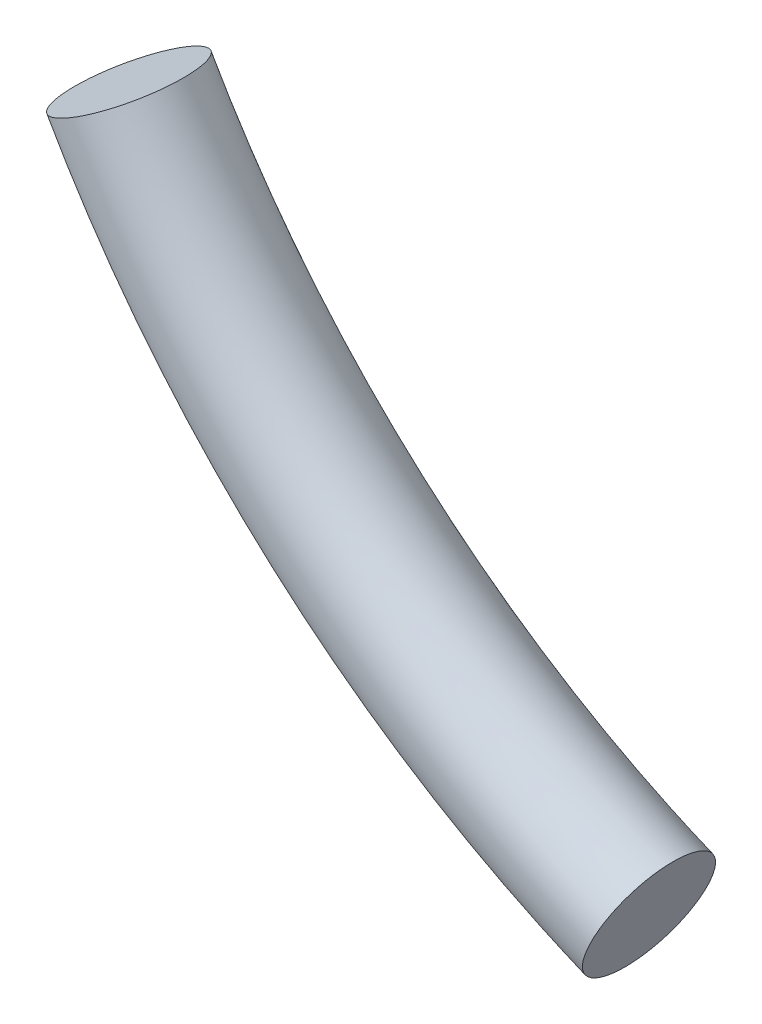
ISO-10303-21;
HEADER;
FILE_DESCRIPTION(('STEP AP214'),'2;1');
FILE_NAME('part.step','',(''),(''),'','','');
FILE_SCHEMA(('AUTOMOTIVE_DESIGN { 1 0 10303 214 1 1 1 1 }'));
ENDSEC;
DATA;
#1=APPLICATION_CONTEXT('core data for automotive mechanical design processes');
#2=APPLICATION_PROTOCOL_DEFINITION('international standard','automotive_design',2000,#1);
#3=PRODUCT_CONTEXT('',#1,'mechanical');
#4=PRODUCT('Part','Part','',(#3));
#5=PRODUCT_RELATED_PRODUCT_CATEGORY('part','',(#4));
#6=PRODUCT_DEFINITION_FORMATION('','',#4);
#7=PRODUCT_DEFINITION_CONTEXT('part definition',#1,'design');
#8=PRODUCT_DEFINITION('design','',#6,#7);
#9=PRODUCT_DEFINITION_SHAPE('','',#8);
#10=(LENGTH_UNIT() NAMED_UNIT(*) SI_UNIT(.MILLI.,.METRE.));
#11=(NAMED_UNIT(*) PLANE_ANGLE_UNIT() SI_UNIT($,.RADIAN.));
#12=(NAMED_UNIT(*) SI_UNIT($,.STERADIAN.) SOLID_ANGLE_UNIT());
#13=UNCERTAINTY_MEASURE_WITH_UNIT(LENGTH_MEASURE(1.E-05),#10,'distance_accuracy_value','');
#14=(GEOMETRIC_REPRESENTATION_CONTEXT(3) GLOBAL_UNCERTAINTY_ASSIGNED_CONTEXT((#13)) GLOBAL_UNIT_ASSIGNED_CONTEXT((#10,
#11,#12)) REPRESENTATION_CONTEXT('',''));
#15=CARTESIAN_POINT('',(0.,0.,0.));
#16=DIRECTION('',(0.,0.,1.));
#17=DIRECTION('',(1.,0.,0.));
#18=AXIS2_PLACEMENT_3D('',#15,#16,#17);
#19=CARTESIAN_POINT('',(0.,0.,-107.5));
#20=DIRECTION('',(-0.491846967669776,0.870681664211465,0.));
#21=DIRECTION('',(-0.870681664211465,-0.491846967669776,0.));
#22=AXIS2_PLACEMENT_3D('',#19,#20,#21);
#23=PLANE('',#22);
#24=CARTESIAN_POINT('',(-6.32304332916155,-3.57187915598206,-102.2302));
#25=CARTESIAN_POINT('',(-6.32304172216329,-3.57187824819078,-102.25265524156));
#26=CARTESIAN_POINT('',(-6.32139090801497,-3.57094570537242,-102.275130857259));
#27=CARTESIAN_POINT('',(-6.31482343351021,-3.5672357473554,-102.319482451298));
#28=CARTESIAN_POINT('',(-6.30989978350673,-3.56445438371399,-102.341357041711));
#29=CARTESIAN_POINT('',(-6.2969333229611,-3.55712964659948,-102.383809618347));
#30=CARTESIAN_POINT('',(-6.28889607957243,-3.55258941800431,-102.404389843003));
#31=CARTESIAN_POINT('',(-6.26991567433977,-3.54186741116466,-102.443737337222));
#32=CARTESIAN_POINT('',(-6.25896839012532,-3.53568330419834,-102.46250198299));
#33=CARTESIAN_POINT('',(-6.2345019676866,-3.52186225319791,-102.497627484938));
#34=CARTESIAN_POINT('',(-6.22098647770209,-3.5142273700498,-102.513991693303));
#35=CARTESIAN_POINT('',(-6.19173608714498,-3.49770386152766,-102.543904884907));
#36=CARTESIAN_POINT('',(-6.17599810610279,-3.48881349600026,-102.557449895039));
#37=CARTESIAN_POINT('',(-6.14277670580989,-3.47004676911552,-102.581301941874));
#38=CARTESIAN_POINT('',(-6.12529456621462,-3.46017113063392,-102.5916113298));
#39=CARTESIAN_POINT('',(-6.08907038413636,-3.4397081361276,-102.608713483024));
#40=CARTESIAN_POINT('',(-6.0703282676056,-3.42912073827339,-102.615506041437));
#41=CARTESIAN_POINT('',(-6.03211770610177,-3.40753564054926,-102.625380612929));
#42=CARTESIAN_POINT('',(-6.01264928250519,-3.39653795275488,-102.628462735124));
#43=CARTESIAN_POINT('',(-5.97353823169905,-3.37444416976612,-102.630829316177));
#44=CARTESIAN_POINT('',(-5.95389560448949,-3.36334807457174,-102.630113775036));
#45=CARTESIAN_POINT('',(-5.91499316252704,-3.34137213445417,-102.624905254934));
#46=CARTESIAN_POINT('',(-5.89573335904942,-3.33049229590036,-102.620412164882));
#47=CARTESIAN_POINT('',(-5.85814505886288,-3.30925871280504,-102.607776350926));
#48=CARTESIAN_POINT('',(-5.83981650744378,-3.29890493735781,-102.599633841699));
#49=CARTESIAN_POINT('',(-5.80459682769468,-3.27900938494304,-102.579923114515));
#50=CARTESIAN_POINT('',(-5.78770675682602,-3.26946820533407,-102.568352403919));
#51=CARTESIAN_POINT('',(-5.75588157810259,-3.25149020224285,-102.542134850302));
#52=CARTESIAN_POINT('',(-5.74094377032538,-3.24305185357783,-102.527492330157));
#53=CARTESIAN_POINT('',(-5.71339920920925,-3.22749196594308,-102.495513974748));
#54=CARTESIAN_POINT('',(-5.70079577722735,-3.22037230320372,-102.478174365578));
#55=CARTESIAN_POINT('',(-5.67832059912858,-3.20767610360507,-102.441335318358));
#56=CARTESIAN_POINT('',(-5.66844499350969,-3.20209738651798,-102.421838987082));
#57=CARTESIAN_POINT('',(-5.65166638785582,-3.19261917346745,-102.381186262625));
#58=CARTESIAN_POINT('',(-5.64476871936395,-3.18872268928596,-102.36002697154));
#59=CARTESIAN_POINT('',(-5.63417993713913,-3.18274109963882,-102.316713490036));
#60=CARTESIAN_POINT('',(-5.63048199943244,-3.18065213931908,-102.294561523395));
#61=CARTESIAN_POINT('',(-5.62714060817691,-3.17876459163732,-102.258269762147));
#62=CARTESIAN_POINT('',(-5.6264969931081,-3.17840101430136,-102.244238862857));
#63=CARTESIAN_POINT('',(-5.62649960479063,-3.17840248963751,-102.20774475844));
#64=CARTESIAN_POINT('',(-5.62815041893895,-3.17933503245587,-102.185269142741));
#65=CARTESIAN_POINT('',(-5.63471789344371,-3.18304499047289,-102.140917548703));
#66=CARTESIAN_POINT('',(-5.63964154344719,-3.1858263541143,-102.119042958289));
#67=CARTESIAN_POINT('',(-5.65260800399282,-3.19315109122882,-102.076590381653));
#68=CARTESIAN_POINT('',(-5.66064524738149,-3.19769131982398,-102.056010156997));
#69=CARTESIAN_POINT('',(-5.67962565261415,-3.20841332666363,-102.016662662778));
#70=CARTESIAN_POINT('',(-5.6905729368286,-3.21459743362995,-101.99789801701));
#71=CARTESIAN_POINT('',(-5.71503935926732,-3.22841848463039,-101.962772515062));
#72=CARTESIAN_POINT('',(-5.72855484925183,-3.23605336777849,-101.946408306697));
#73=CARTESIAN_POINT('',(-5.75780523980894,-3.25257687630063,-101.916495115093));
#74=CARTESIAN_POINT('',(-5.77354322085113,-3.26146724182803,-101.902950104961));
#75=CARTESIAN_POINT('',(-5.80676462114403,-3.28023396871277,-101.879098058126));
#76=CARTESIAN_POINT('',(-5.8242467607393,-3.29010960719437,-101.8687886702));
#77=CARTESIAN_POINT('',(-5.86047094281756,-3.31057260170069,-101.851686516976));
#78=CARTESIAN_POINT('',(-5.87921305934832,-3.3211599995549,-101.844893958563));
#79=CARTESIAN_POINT('',(-5.91742362085215,-3.34274509727903,-101.835019387071));
#80=CARTESIAN_POINT('',(-5.93689204444873,-3.35374278507342,-101.831937264876));
#81=CARTESIAN_POINT('',(-5.97600309525487,-3.37583656806217,-101.829570683823));
#82=CARTESIAN_POINT('',(-5.99564572246443,-3.38693266325655,-101.830286224964));
#83=CARTESIAN_POINT('',(-6.03454816442688,-3.40890860337412,-101.835494745066));
#84=CARTESIAN_POINT('',(-6.0538079679045,-3.41978844192793,-101.839987835118));
#85=CARTESIAN_POINT('',(-6.09139626809104,-3.44102202502326,-101.852623649074));
#86=CARTESIAN_POINT('',(-6.10972481951014,-3.45137580047048,-101.860766158301));
#87=CARTESIAN_POINT('',(-6.14494449925924,-3.47127135288525,-101.880476885485));
#88=CARTESIAN_POINT('',(-6.1618345701279,-3.48081253249422,-101.892047596081));
#89=CARTESIAN_POINT('',(-6.19365974885133,-3.49879053558545,-101.918265149698));
#90=CARTESIAN_POINT('',(-6.20859755662853,-3.50722888425046,-101.932907669844));
#91=CARTESIAN_POINT('',(-6.23614211774466,-3.52278877188521,-101.964886025252));
#92=CARTESIAN_POINT('',(-6.24874554972657,-3.52990843462457,-101.982225634422));
#93=CARTESIAN_POINT('',(-6.27122072782534,-3.54260463422323,-102.019064681642));
#94=CARTESIAN_POINT('',(-6.28109633344423,-3.54818335131032,-102.038561012918));
#95=CARTESIAN_POINT('',(-6.2978749390981,-3.55766156436084,-102.079213737375));
#96=CARTESIAN_POINT('',(-6.30477260758997,-3.56155804854234,-102.10037302846));
#97=CARTESIAN_POINT('',(-6.31536138981479,-3.56753963818947,-102.143686509964));
#98=CARTESIAN_POINT('',(-6.31905932752148,-3.56962859850921,-102.165838476605));
#99=CARTESIAN_POINT('',(-6.32240071877701,-3.57151614619097,-102.202130237853));
#100=CARTESIAN_POINT('',(-6.32304433384582,-3.57187972352693,-102.216161137143));
#101=CARTESIAN_POINT('',(-6.32304332916155,-3.57187915598206,-102.2302));
#102=B_SPLINE_CURVE_WITH_KNOTS('',3,(#24,#25,#26,#27,#28,#29,#30,#31,#32,#33,#34,#35,#36,#37,
#38,#39,#40,#41,#42,#43,#44,#45,#46,#47,#48,#49,#50,#51,#52,#53,#54,#55,#56,#57,#58,#59,#60,#61,
#62,#63,#64,#65,#66,#67,#68,#69,#70,#71,#72,#73,#74,#75,#76,#77,#78,#79,#80,#81,#82,#83,#84,#85,
#86,#87,#88,#89,#90,#91,#92,#93,#94,#95,#96,#97,#98,#99,#100,#101),.UNSPECIFIED.,.T.,.F.,(4,2,2,
2,2,2,2,2,2,2,2,2,2,2,2,2,2,2,2,2,2,2,2,2,2,2,2,2,2,2,2,2,2,2,2,2,2,2,4),(0.,0.0673217190940813,
0.134787678055445,0.202133559490878,0.269575356418609,0.336922056232666,0.404363034793442,
0.471754892083641,0.539150713403539,0.606544552708795,0.673938392014053,0.741334213333949,
0.808726070624145,0.876167049184931,0.943513748998996,1.01095554592845,1.07830142736559,
1.1457673863287,1.21308910542448,1.25517818200736,1.32249990110144,1.3899658600628,
1.45731174149823,1.52475353842596,1.59210023824002,1.6595412168008,1.72693307409099,
1.7943288954109,1.86172273471615,1.92911657402141,1.9965123953413,2.0639042526315,
2.13134523119229,2.19869193100635,2.2661337279358,2.33347960937294,2.40094556833606,
2.46826728743184,2.51035636401471),.UNSPECIFIED.);
#103=CARTESIAN_POINT('',(-6.32304332916155,-3.57187915598206,-102.2302));
#104=VERTEX_POINT('',#103);
#105=EDGE_CURVE('E19',#104,#104,#102,.T.);
#106=ORIENTED_EDGE('',*,*,#105,.F.);
#107=EDGE_LOOP('',(#106));
#108=FACE_BOUND('',#107,.T.);
#109=ADVANCED_FACE('F15',(#108),#23,.T.);
#110=CARTESIAN_POINT('',(0.,0.,-107.5));
#111=DIRECTION('',(-0.923625857580072,0.383295284616804,0.));
#112=DIRECTION('',(-0.383295284616804,-0.923625857580072,0.));
#113=AXIS2_PLACEMENT_3D('',#110,#111,#112);
#114=PLANE('',#113);
#115=CARTESIAN_POINT('',(-2.47692152035022,-5.96863268401315,-102.2302));
#116=CARTESIAN_POINT('',(-2.47692222779001,-5.96863438872935,-102.25265524156));
#117=CARTESIAN_POINT('',(-2.47764895640374,-5.97038558517246,-102.275130857259));
#118=CARTESIAN_POINT('',(-2.48054011871137,-5.97735241302807,-102.319482451298));
#119=CARTESIAN_POINT('',(-2.48270762941822,-5.98257545911232,-102.341357041711));
#120=CARTESIAN_POINT('',(-2.4884157813061,-5.99633038095517,-102.383809618347));
#121=CARTESIAN_POINT('',(-2.49195397169051,-6.00485635103422,-102.404389843003));
#122=CARTESIAN_POINT('',(-2.50030960857231,-6.02499091201193,-102.443737337222));
#123=CARTESIAN_POINT('',(-2.50512886983763,-6.03660387595312,-102.46250198299));
#124=CARTESIAN_POINT('',(-2.51589958517215,-6.06255804650217,-102.497627484938));
#125=CARTESIAN_POINT('',(-2.5218494331973,-6.07689538302902,-102.513991693303));
#126=CARTESIAN_POINT('',(-2.5347261678692,-6.10792442403602,-102.543904884907));
#127=CARTESIAN_POINT('',(-2.54165441061372,-6.12461939630219,-102.557449895039));
#128=CARTESIAN_POINT('',(-2.55627928053351,-6.15986091521408,-102.581301941874));
#129=CARTESIAN_POINT('',(-2.56397534437327,-6.17840610439138,-102.5916113298));
#130=CARTESIAN_POINT('',(-2.57992211200421,-6.21683299749413,-102.608713483024));
#131=CARTESIAN_POINT('',(-2.58817284839302,-6.23671477997001,-102.615506041437));
#132=CARTESIAN_POINT('',(-2.6049940686495,-6.27724883976275,-102.625380612929));
#133=CARTESIAN_POINT('',(-2.61356454310672,-6.29790109440327,-102.628462735124));
#134=CARTESIAN_POINT('',(-2.63078218069643,-6.3393904002271,-102.630829316177));
#135=CARTESIAN_POINT('',(-2.63942934382892,-6.36022745141042,-102.630113775036));
#136=CARTESIAN_POINT('',(-2.65655514672244,-6.40149546335607,-102.624905254934));
#137=CARTESIAN_POINT('',(-2.66503378151981,-6.42192641215748,-102.620412164882));
#138=CARTESIAN_POINT('',(-2.68158106718169,-6.46180037232203,-102.607776350926));
#139=CARTESIAN_POINT('',(-2.68964974213094,-6.48124344172214,-102.599633841699));
#140=CARTESIAN_POINT('',(-2.70515430335972,-6.51860475096875,-102.579923114515));
#141=CARTESIAN_POINT('',(-2.712589724119,-6.53652186905207,-102.568352403919));
#142=CARTESIAN_POINT('',(-2.72659994328196,-6.5702822653017,-102.542134850302));
#143=CARTESIAN_POINT('',(-2.7331759302573,-6.58612840756665,-102.527492330157));
#144=CARTESIAN_POINT('',(-2.74530171724308,-6.6153478914817,-102.495513974748));
#145=CARTESIAN_POINT('',(-2.75085005511123,-6.62871770981052,-102.478174365578));
#146=CARTESIAN_POINT('',(-2.76074417616635,-6.65255955293069,-102.441335318358));
#147=CARTESIAN_POINT('',(-2.76509165840015,-6.66303567191171,-102.421838987082));
#148=CARTESIAN_POINT('',(-2.77247800945579,-6.68083454683127,-102.381186262625));
#149=CARTESIAN_POINT('',(-2.77551453120244,-6.68815164702756,-102.36002697154));
#150=CARTESIAN_POINT('',(-2.78017597115625,-6.6993843092796,-102.316713490036));
#151=CARTESIAN_POINT('',(-2.78180389344294,-6.70330711025957,-102.294561523395));
#152=CARTESIAN_POINT('',(-2.78327485529381,-6.70685168400076,-102.258269762147));
#153=CARTESIAN_POINT('',(-2.78355819033016,-6.70753443585407,-102.244238862857));
#154=CARTESIAN_POINT('',(-2.78355704060387,-6.70753166536101,-102.20774475844));
#155=CARTESIAN_POINT('',(-2.78283031199015,-6.7057804689179,-102.185269142741));
#156=CARTESIAN_POINT('',(-2.77993914968251,-6.69881364106229,-102.140917548703));
#157=CARTESIAN_POINT('',(-2.77777163897566,-6.69359059497803,-102.119042958289));
#158=CARTESIAN_POINT('',(-2.77206348708778,-6.67983567313518,-102.076590381653));
#159=CARTESIAN_POINT('',(-2.76852529670337,-6.67130970305614,-102.056010156997));
#160=CARTESIAN_POINT('',(-2.76016965982157,-6.65117514207843,-102.016662662778));
#161=CARTESIAN_POINT('',(-2.75535039855625,-6.63956217813724,-101.99789801701));
#162=CARTESIAN_POINT('',(-2.74457968322173,-6.61360800758818,-101.962772515062));
#163=CARTESIAN_POINT('',(-2.73862983519658,-6.59927067106134,-101.946408306697));
#164=CARTESIAN_POINT('',(-2.72575310052468,-6.56824163005434,-101.916495115093));
#165=CARTESIAN_POINT('',(-2.71882485778016,-6.55154665778817,-101.902950104961));
#166=CARTESIAN_POINT('',(-2.70419998786037,-6.51630513887628,-101.879098058126));
#167=CARTESIAN_POINT('',(-2.69650392402061,-6.49775994969897,-101.8687886702));
#168=CARTESIAN_POINT('',(-2.68055715638967,-6.45933305659623,-101.851686516976));
#169=CARTESIAN_POINT('',(-2.67230642000086,-6.43945127412035,-101.844893958563));
#170=CARTESIAN_POINT('',(-2.65548519974438,-6.39891721432761,-101.835019387071));
#171=CARTESIAN_POINT('',(-2.64691472528717,-6.37826495968709,-101.831937264876));
#172=CARTESIAN_POINT('',(-2.62969708769745,-6.33677565386326,-101.829570683823));
#173=CARTESIAN_POINT('',(-2.62104992456496,-6.31593860267994,-101.830286224964));
#174=CARTESIAN_POINT('',(-2.60392412167144,-6.27467059073429,-101.835494745066));
#175=CARTESIAN_POINT('',(-2.59544548687407,-6.25423964193287,-101.839987835118));
#176=CARTESIAN_POINT('',(-2.57889820121219,-6.21436568176833,-101.852623649074));
#177=CARTESIAN_POINT('',(-2.57082952626294,-6.19492261236822,-101.860766158301));
#178=CARTESIAN_POINT('',(-2.55532496503416,-6.1575613031216,-101.880476885485));
#179=CARTESIAN_POINT('',(-2.54788954427488,-6.13964418503829,-101.892047596081));
#180=CARTESIAN_POINT('',(-2.53387932511192,-6.10588378878866,-101.918265149698));
#181=CARTESIAN_POINT('',(-2.52730333813659,-6.0900376465237,-101.932907669844));
#182=CARTESIAN_POINT('',(-2.5151775511508,-6.06081816260866,-101.964886025252));
#183=CARTESIAN_POINT('',(-2.50962921328265,-6.04744834427984,-101.982225634422));
#184=CARTESIAN_POINT('',(-2.49973509222753,-6.02360650115966,-102.019064681642));
#185=CARTESIAN_POINT('',(-2.49538760999373,-6.01313038217865,-102.038561012918));
#186=CARTESIAN_POINT('',(-2.48800125893809,-5.99533150725909,-102.079213737375));
#187=CARTESIAN_POINT('',(-2.48496473719145,-5.9880144070628,-102.10037302846));
#188=CARTESIAN_POINT('',(-2.48030329723763,-5.97678174481076,-102.143686509964));
#189=CARTESIAN_POINT('',(-2.47867537495094,-5.97285894383078,-102.165838476605));
#190=CARTESIAN_POINT('',(-2.47720441310008,-5.96931437008959,-102.202130237853));
#191=CARTESIAN_POINT('',(-2.47692107806372,-5.96863161823628,-102.216161137143));
#192=CARTESIAN_POINT('',(-2.47692152035022,-5.96863268401315,-102.2302));
#193=B_SPLINE_CURVE_WITH_KNOTS('',3,(#115,#116,#117,#118,#119,#120,#121,#122,#123,#124,#125,
#126,#127,#128,#129,#130,#131,#132,#133,#134,#135,#136,#137,#138,#139,#140,#141,#142,#143,#144,
#145,#146,#147,#148,#149,#150,#151,#152,#153,#154,#155,#156,#157,#158,#159,#160,#161,#162,#163,
#164,#165,#166,#167,#168,#169,#170,#171,#172,#173,#174,#175,#176,#177,#178,#179,#180,#181,#182,
#183,#184,#185,#186,#187,#188,#189,#190,#191,#192),.UNSPECIFIED.,.T.,.F.,(4,2,2,2,2,2,2,2,2,2,2,
2,2,2,2,2,2,2,2,2,2,2,2,2,2,2,2,2,2,2,2,2,2,2,2,2,2,2,4),(0.,0.0673217190940813,
0.134787678055446,0.202133559490878,0.26957535641861,0.336922056232666,0.404363034793443,
0.47175489208364,0.53915071340354,0.606544552708794,0.673938392014052,0.741334213333949,
0.808726070624147,0.87616704918493,0.943513748998994,1.01095554592845,1.07830142736559,
1.1457673863287,1.21308910542448,1.25517818200736,1.32249990110144,1.3899658600628,
1.45731174149823,1.52475353842596,1.59210023824002,1.6595412168008,1.726933074091,
1.79432889541089,1.86172273471615,1.92911657402141,1.99651239534131,2.0639042526315,
2.13134523119229,2.19869193100635,2.2661337279358,2.33347960937294,2.40094556833606,
2.46826728743184,2.51035636401471),.UNSPECIFIED.);
#194=CARTESIAN_POINT('',(-2.47692152035022,-5.96863268401315,-102.2302));
#195=VERTEX_POINT('',#194);
#196=EDGE_CURVE('E10',#195,#195,#193,.T.);
#197=ORIENTED_EDGE('',*,*,#196,.F.);
#198=EDGE_LOOP('',(#197));
#199=FACE_BOUND('',#198,.T.);
#200=ADVANCED_FACE('F35',(#199),#114,.F.);
#201=CARTESIAN_POINT('',(0.,0.,-102.2302));
#202=DIRECTION('',(0.,0.,1.));
#203=DIRECTION('',(-0.491846967669776,0.870681664211465,0.));
#204=AXIS2_PLACEMENT_3D('',#201,#202,#203);
#205=TOROIDAL_SURFACE('',#204,6.86217582046821,0.4);
#206=ORIENTED_EDGE('',*,*,#105,.T.);
#207=EDGE_LOOP('',(#206));
#208=FACE_BOUND('',#207,.T.);
#209=ORIENTED_EDGE('',*,*,#196,.T.);
#210=EDGE_LOOP('',(#209));
#211=FACE_BOUND('',#210,.T.);
#212=ADVANCED_FACE('F37',(#208,#211),#205,.T.);
#213=CLOSED_SHELL('',(#109,#200,#212));
#214=MANIFOLD_SOLID_BREP('B1',#213);
#215=ADVANCED_BREP_SHAPE_REPRESENTATION('',(#18,#214),#14);
#216=SHAPE_DEFINITION_REPRESENTATION(#9,#215);
ENDSEC;
END-ISO-10303-21;
